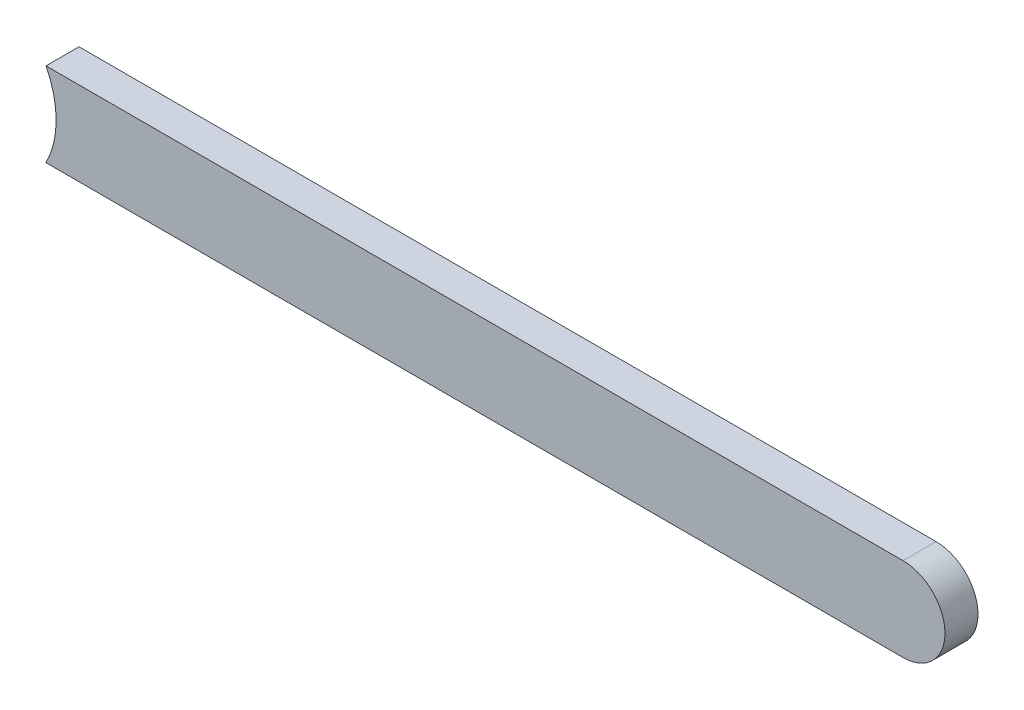
ISO-10303-21;
HEADER;
FILE_DESCRIPTION(('STEP AP214'),'2;1');
FILE_NAME('part.step','',(''),(''),'','','');
FILE_SCHEMA(('AUTOMOTIVE_DESIGN { 1 0 10303 214 1 1 1 1 }'));
ENDSEC;
DATA;
#1=APPLICATION_CONTEXT('core data for automotive mechanical design processes');
#2=APPLICATION_PROTOCOL_DEFINITION('international standard','automotive_design',2000,#1);
#3=PRODUCT_CONTEXT('',#1,'mechanical');
#4=PRODUCT('Part','Part','',(#3));
#5=PRODUCT_RELATED_PRODUCT_CATEGORY('part','',(#4));
#6=PRODUCT_DEFINITION_FORMATION('','',#4);
#7=PRODUCT_DEFINITION_CONTEXT('part definition',#1,'design');
#8=PRODUCT_DEFINITION('design','',#6,#7);
#9=PRODUCT_DEFINITION_SHAPE('','',#8);
#10=(LENGTH_UNIT() NAMED_UNIT(*) SI_UNIT(.MILLI.,.METRE.));
#11=(NAMED_UNIT(*) PLANE_ANGLE_UNIT() SI_UNIT($,.RADIAN.));
#12=(NAMED_UNIT(*) SI_UNIT($,.STERADIAN.) SOLID_ANGLE_UNIT());
#13=UNCERTAINTY_MEASURE_WITH_UNIT(LENGTH_MEASURE(1.E-05),#10,'distance_accuracy_value','');
#14=(GEOMETRIC_REPRESENTATION_CONTEXT(3) GLOBAL_UNCERTAINTY_ASSIGNED_CONTEXT((#13)) GLOBAL_UNIT_ASSIGNED_CONTEXT((#10,
#11,#12)) REPRESENTATION_CONTEXT('',''));
#15=CARTESIAN_POINT('',(0.,0.,0.));
#16=DIRECTION('',(0.,0.,1.));
#17=DIRECTION('',(1.,0.,0.));
#18=AXIS2_PLACEMENT_3D('',#15,#16,#17);
#19=CARTESIAN_POINT('',(134.224466490858,83.0550028,0.));
#20=DIRECTION('',(0.,1.,0.));
#21=DIRECTION('',(1.,0.,0.));
#22=AXIS2_PLACEMENT_3D('',#19,#20,#21);
#23=PLANE('',#22);
#24=DIRECTION('',(1.,0.,0.));
#25=VECTOR('',#24,1.);
#26=CARTESIAN_POINT('',(133.731,83.0550028,0.1999996));
#27=LINE('',#26,#25);
#28=CARTESIAN_POINT('',(134.224466490858,83.0550028,0.1999996));
#29=VERTEX_POINT('',#28);
#30=CARTESIAN_POINT('',(139.4144532,83.0550028,0.1999996));
#31=VERTEX_POINT('',#30);
#32=EDGE_CURVE('E11',#29,#31,#27,.T.);
#33=ORIENTED_EDGE('',*,*,#32,.F.);
#34=DIRECTION('',(0.,0.,1.));
#35=VECTOR('',#34,1.);
#36=CARTESIAN_POINT('',(134.224466490858,83.0550028,0.));
#37=LINE('',#36,#35);
#38=CARTESIAN_POINT('',(134.224466490858,83.0550028,0.));
#39=VERTEX_POINT('',#38);
#40=EDGE_CURVE('E24',#39,#29,#37,.T.);
#41=ORIENTED_EDGE('',*,*,#40,.F.);
#42=DIRECTION('',(1.,0.,0.));
#43=VECTOR('',#42,1.);
#44=CARTESIAN_POINT('',(133.731,83.0550028,0.));
#45=LINE('',#44,#43);
#46=CARTESIAN_POINT('',(139.4144532,83.0550028,0.));
#47=VERTEX_POINT('',#46);
#48=EDGE_CURVE('E82',#39,#47,#45,.T.);
#49=ORIENTED_EDGE('',*,*,#48,.T.);
#50=DIRECTION('',(0.,0.,1.));
#51=VECTOR('',#50,1.);
#52=CARTESIAN_POINT('',(139.4144532,83.0550028,0.));
#53=LINE('',#52,#51);
#54=EDGE_CURVE('E37',#47,#31,#53,.T.);
#55=ORIENTED_EDGE('',*,*,#54,.T.);
#56=EDGE_LOOP('',(#33,#41,#49,#55));
#57=FACE_BOUND('',#56,.T.);
#58=ADVANCED_FACE('F17',(#57),#23,.F.);
#59=CARTESIAN_POINT('',(139.4144532,83.3090028,0.));
#60=DIRECTION('',(0.,0.,-1.));
#61=DIRECTION('',(1.11896493820486E-13,-1.,0.));
#62=AXIS2_PLACEMENT_3D('',#59,#60,#61);
#63=CYLINDRICAL_SURFACE('',#62,0.254000000000005);
#64=CARTESIAN_POINT('',(139.4144532,83.3090028,0.1999996));
#65=DIRECTION('',(0.,0.,1.));
#66=DIRECTION('',(1.11896493820486E-13,-1.,0.));
#67=AXIS2_PLACEMENT_3D('',#64,#65,#66);
#68=CIRCLE('',#67,0.254000000000005);
#69=CARTESIAN_POINT('',(139.4144532,83.5630028,0.1999996));
#70=VERTEX_POINT('',#69);
#71=EDGE_CURVE('E97',#31,#70,#68,.T.);
#72=ORIENTED_EDGE('',*,*,#71,.F.);
#73=ORIENTED_EDGE('',*,*,#54,.F.);
#74=CARTESIAN_POINT('',(139.4144532,83.3090028,0.));
#75=DIRECTION('',(0.,0.,1.));
#76=DIRECTION('',(1.11896493820486E-13,-1.,0.));
#77=AXIS2_PLACEMENT_3D('',#74,#75,#76);
#78=CIRCLE('',#77,0.254000000000005);
#79=CARTESIAN_POINT('',(139.4144532,83.5630028,0.));
#80=VERTEX_POINT('',#79);
#81=EDGE_CURVE('E94',#47,#80,#78,.T.);
#82=ORIENTED_EDGE('',*,*,#81,.T.);
#83=DIRECTION('',(0.,0.,1.));
#84=VECTOR('',#83,1.);
#85=CARTESIAN_POINT('',(139.4144532,83.5630028,0.));
#86=LINE('',#85,#84);
#87=EDGE_CURVE('E92',#80,#70,#86,.T.);
#88=ORIENTED_EDGE('',*,*,#87,.T.);
#89=EDGE_LOOP('',(#72,#73,#82,#88));
#90=FACE_BOUND('',#89,.T.);
#91=ADVANCED_FACE('F103',(#90),#63,.T.);
#92=CARTESIAN_POINT('',(139.4144532,83.5630028,0.));
#93=DIRECTION('',(0.,-1.,0.));
#94=DIRECTION('',(-1.,0.,0.));
#95=AXIS2_PLACEMENT_3D('',#92,#93,#94);
#96=PLANE('',#95);
#97=DIRECTION('',(-1.,0.,0.));
#98=VECTOR('',#97,1.);
#99=CARTESIAN_POINT('',(139.4144532,83.5630028,0.1999996));
#100=LINE('',#99,#98);
#101=CARTESIAN_POINT('',(134.224466490858,83.5630028,0.1999996));
#102=VERTEX_POINT('',#101);
#103=EDGE_CURVE('E89',#70,#102,#100,.T.);
#104=ORIENTED_EDGE('',*,*,#103,.F.);
#105=ORIENTED_EDGE('',*,*,#87,.F.);
#106=DIRECTION('',(-1.,0.,0.));
#107=VECTOR('',#106,1.);
#108=CARTESIAN_POINT('',(139.4144532,83.5630028,0.));
#109=LINE('',#108,#107);
#110=CARTESIAN_POINT('',(134.224466490858,83.5630028,0.));
#111=VERTEX_POINT('',#110);
#112=EDGE_CURVE('E87',#80,#111,#109,.T.);
#113=ORIENTED_EDGE('',*,*,#112,.T.);
#114=DIRECTION('',(0.,0.,1.));
#115=VECTOR('',#114,1.);
#116=CARTESIAN_POINT('',(134.224466490858,83.5630028,0.));
#117=LINE('',#116,#115);
#118=EDGE_CURVE('E69',#111,#102,#117,.T.);
#119=ORIENTED_EDGE('',*,*,#118,.T.);
#120=EDGE_LOOP('',(#104,#105,#113,#119));
#121=FACE_BOUND('',#120,.T.);
#122=ADVANCED_FACE('F108',(#121),#96,.F.);
#123=CARTESIAN_POINT('',(133.731,83.3090028,0.));
#124=DIRECTION('',(0.,0.,-1.));
#125=DIRECTION('',(1.,0.,0.));
#126=AXIS2_PLACEMENT_3D('',#123,#124,#125);
#127=CYLINDRICAL_SURFACE('',#126,0.55500016);
#128=DIRECTION('',(0.,0.,1.));
#129=VECTOR('',#128,1.);
#130=CARTESIAN_POINT('',(134.28600016,83.3090028,0.));
#131=LINE('',#130,#129);
#132=CARTESIAN_POINT('',(134.28600016,83.3090028,0.));
#133=VERTEX_POINT('',#132);
#134=CARTESIAN_POINT('',(134.28600016,83.3090028,0.1999996));
#135=VERTEX_POINT('',#134);
#136=EDGE_CURVE('E59',#133,#135,#131,.T.);
#137=ORIENTED_EDGE('',*,*,#136,.T.);
#138=CARTESIAN_POINT('',(133.731,83.3090028,0.1999996));
#139=DIRECTION('',(0.,0.,1.));
#140=DIRECTION('',(1.,0.,0.));
#141=AXIS2_PLACEMENT_3D('',#138,#139,#140);
#142=CIRCLE('',#141,0.55500016);
#143=EDGE_CURVE('E70',#135,#102,#142,.T.);
#144=ORIENTED_EDGE('',*,*,#143,.T.);
#145=ORIENTED_EDGE('',*,*,#118,.F.);
#146=CARTESIAN_POINT('',(133.731,83.3090028,0.));
#147=DIRECTION('',(0.,0.,1.));
#148=DIRECTION('',(1.,0.,0.));
#149=AXIS2_PLACEMENT_3D('',#146,#147,#148);
#150=CIRCLE('',#149,0.55500016);
#151=EDGE_CURVE('E73',#133,#111,#150,.T.);
#152=ORIENTED_EDGE('',*,*,#151,.F.);
#153=EDGE_LOOP('',(#137,#144,#145,#152));
#154=FACE_BOUND('',#153,.T.);
#155=ADVANCED_FACE('F74',(#154),#127,.F.);
#156=CARTESIAN_POINT('',(133.731,83.3090028,0.));
#157=DIRECTION('',(0.,0.,-1.));
#158=DIRECTION('',(1.,0.,0.));
#159=AXIS2_PLACEMENT_3D('',#156,#157,#158);
#160=CYLINDRICAL_SURFACE('',#159,0.55500016);
#161=ORIENTED_EDGE('',*,*,#40,.T.);
#162=CARTESIAN_POINT('',(133.731,83.3090028,0.1999996));
#163=DIRECTION('',(0.,0.,1.));
#164=DIRECTION('',(1.,0.,0.));
#165=AXIS2_PLACEMENT_3D('',#162,#163,#164);
#166=CIRCLE('',#165,0.55500016);
#167=EDGE_CURVE('E65',#29,#135,#166,.T.);
#168=ORIENTED_EDGE('',*,*,#167,.T.);
#169=ORIENTED_EDGE('',*,*,#136,.F.);
#170=EDGE_CURVE('E63',#39,#133,#150,.T.);
#171=ORIENTED_EDGE('',*,*,#170,.F.);
#172=EDGE_LOOP('',(#161,#168,#169,#171));
#173=FACE_BOUND('',#172,.T.);
#174=ADVANCED_FACE('F61',(#173),#160,.F.);
#175=CARTESIAN_POINT('',(133.731,83.0550028,0.));
#176=DIRECTION('',(0.,0.,-1.));
#177=DIRECTION('',(-1.,0.,0.));
#178=AXIS2_PLACEMENT_3D('',#175,#176,#177);
#179=PLANE('',#178);
#180=ORIENTED_EDGE('',*,*,#48,.F.);
#181=ORIENTED_EDGE('',*,*,#170,.T.);
#182=ORIENTED_EDGE('',*,*,#151,.T.);
#183=ORIENTED_EDGE('',*,*,#112,.F.);
#184=ORIENTED_EDGE('',*,*,#81,.F.);
#185=EDGE_LOOP('',(#180,#181,#182,#183,#184));
#186=FACE_BOUND('',#185,.T.);
#187=ADVANCED_FACE('F80',(#186),#179,.T.);
#188=CARTESIAN_POINT('',(133.731,83.0550028,0.1999996));
#189=DIRECTION('',(0.,0.,-1.));
#190=DIRECTION('',(-1.,0.,0.));
#191=AXIS2_PLACEMENT_3D('',#188,#189,#190);
#192=PLANE('',#191);
#193=ORIENTED_EDGE('',*,*,#167,.F.);
#194=ORIENTED_EDGE('',*,*,#32,.T.);
#195=ORIENTED_EDGE('',*,*,#71,.T.);
#196=ORIENTED_EDGE('',*,*,#103,.T.);
#197=ORIENTED_EDGE('',*,*,#143,.F.);
#198=EDGE_LOOP('',(#193,#194,#195,#196,#197));
#199=FACE_BOUND('',#198,.T.);
#200=ADVANCED_FACE('F106',(#199),#192,.F.);
#201=CLOSED_SHELL('',(#58,#91,#122,#155,#174,#187,#200));
#202=MANIFOLD_SOLID_BREP('B1',#201);
#203=ADVANCED_BREP_SHAPE_REPRESENTATION('',(#18,#202),#14);
#204=SHAPE_DEFINITION_REPRESENTATION(#9,#203);
ENDSEC;
END-ISO-10303-21;
